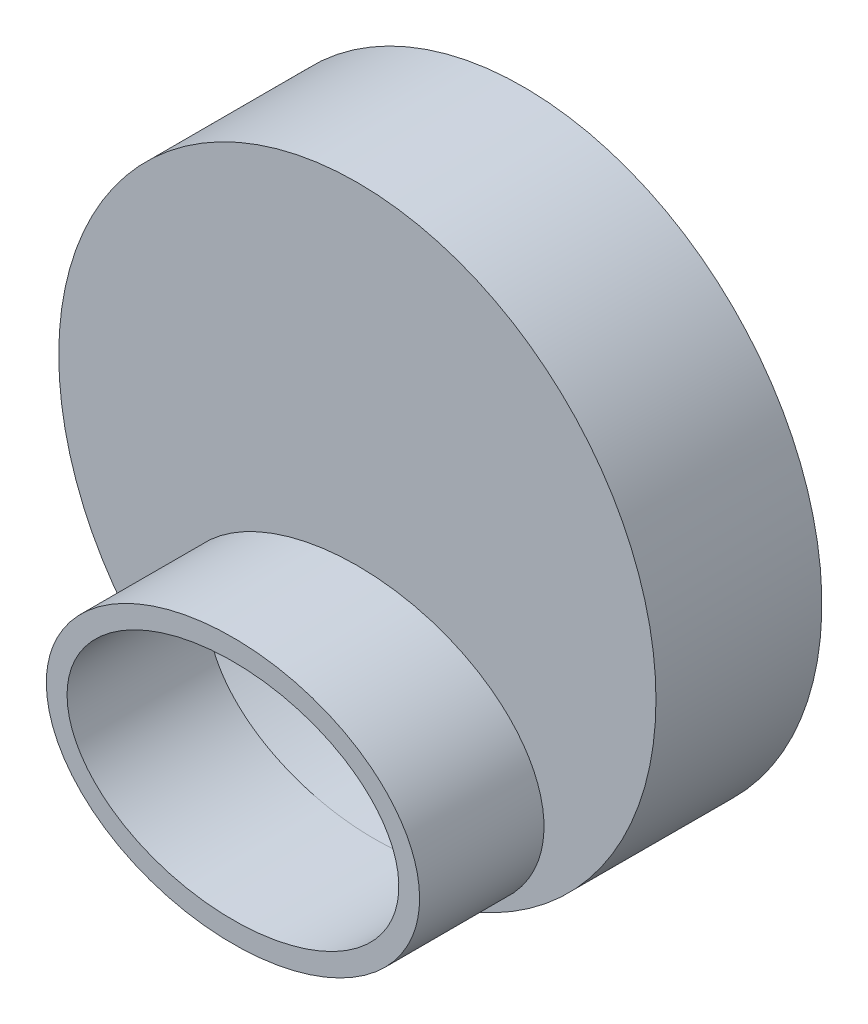
ISO-10303-21;
HEADER;
FILE_DESCRIPTION(('STEP AP214'),'2;1');
FILE_NAME('part.step','',(''),(''),'','','');
FILE_SCHEMA(('AUTOMOTIVE_DESIGN { 1 0 10303 214 1 1 1 1 }'));
ENDSEC;
DATA;
#1=APPLICATION_CONTEXT('core data for automotive mechanical design processes');
#2=APPLICATION_PROTOCOL_DEFINITION('international standard','automotive_design',2000,#1);
#3=PRODUCT_CONTEXT('',#1,'mechanical');
#4=PRODUCT('Part','Part','',(#3));
#5=PRODUCT_RELATED_PRODUCT_CATEGORY('part','',(#4));
#6=PRODUCT_DEFINITION_FORMATION('','',#4);
#7=PRODUCT_DEFINITION_CONTEXT('part definition',#1,'design');
#8=PRODUCT_DEFINITION('design','',#6,#7);
#9=PRODUCT_DEFINITION_SHAPE('','',#8);
#10=(LENGTH_UNIT() NAMED_UNIT(*) SI_UNIT(.MILLI.,.METRE.));
#11=(NAMED_UNIT(*) PLANE_ANGLE_UNIT() SI_UNIT($,.RADIAN.));
#12=(NAMED_UNIT(*) SI_UNIT($,.STERADIAN.) SOLID_ANGLE_UNIT());
#13=UNCERTAINTY_MEASURE_WITH_UNIT(LENGTH_MEASURE(1.E-05),#10,'distance_accuracy_value','');
#14=(GEOMETRIC_REPRESENTATION_CONTEXT(3) GLOBAL_UNCERTAINTY_ASSIGNED_CONTEXT((#13)) GLOBAL_UNIT_ASSIGNED_CONTEXT((#10,
#11,#12)) REPRESENTATION_CONTEXT('',''));
#15=CARTESIAN_POINT('',(0.,0.,0.));
#16=DIRECTION('',(0.,0.,1.));
#17=DIRECTION('',(1.,0.,0.));
#18=AXIS2_PLACEMENT_3D('',#15,#16,#17);
#19=CARTESIAN_POINT('',(0.,20.,0.));
#20=DIRECTION('',(0.,0.,1.));
#21=DIRECTION('',(1.,0.,0.));
#22=AXIS2_PLACEMENT_3D('',#19,#20,#21);
#23=PLANE('',#22);
#24=CARTESIAN_POINT('',(0.,0.,0.));
#25=DIRECTION('',(0.,0.,1.));
#26=DIRECTION('',(-1.,0.,0.));
#27=AXIS2_PLACEMENT_3D('',#24,#25,#26);
#28=ELLIPSE('',#27,20.,13.5);
#29=CARTESIAN_POINT('',(0.,-13.5,0.));
#30=VERTEX_POINT('',#29);
#31=EDGE_CURVE('E52',#30,#30,#28,.T.);
#32=ORIENTED_EDGE('',*,*,#31,.T.);
#33=CARTESIAN_POINT('',(0.,20.,0.));
#34=DIRECTION('',(0.,0.,-1.));
#35=DIRECTION('',(-1.,0.,0.));
#36=AXIS2_PLACEMENT_3D('',#33,#34,#35);
#37=CIRCLE('',#36,33.5);
#38=EDGE_CURVE('E57',#30,#30,#37,.T.);
#39=ORIENTED_EDGE('',*,*,#38,.T.);
#40=EDGE_LOOP('',(#32,#39));
#41=FACE_BOUND('',#40,.T.);
#42=ADVANCED_FACE('F43',(#41),#23,.F.);
#43=CARTESIAN_POINT('',(0.,20.,2.));
#44=DIRECTION('',(0.,0.,1.));
#45=DIRECTION('',(1.,0.,0.));
#46=AXIS2_PLACEMENT_3D('',#43,#44,#45);
#47=PLANE('',#46);
#48=CARTESIAN_POINT('',(0.,20.,2.));
#49=DIRECTION('',(0.,0.,1.));
#50=DIRECTION('',(1.,0.,0.));
#51=AXIS2_PLACEMENT_3D('',#48,#49,#50);
#52=CIRCLE('',#51,36.);
#53=CARTESIAN_POINT('',(0.,-16.,2.));
#54=VERTEX_POINT('',#53);
#55=EDGE_CURVE('E11',#54,#54,#52,.T.);
#56=ORIENTED_EDGE('',*,*,#55,.T.);
#57=CARTESIAN_POINT('',(0.,0.,2.));
#58=DIRECTION('',(0.,0.,1.));
#59=DIRECTION('',(-1.,0.,0.));
#60=AXIS2_PLACEMENT_3D('',#57,#58,#59);
#61=ELLIPSE('',#60,22.5,16.);
#62=EDGE_CURVE('E65',#54,#54,#61,.T.);
#63=ORIENTED_EDGE('',*,*,#62,.F.);
#64=EDGE_LOOP('',(#56,#63));
#65=FACE_BOUND('',#64,.T.);
#66=ADVANCED_FACE('F63',(#65),#47,.T.);
#67=CARTESIAN_POINT('',(0.,20.,2.));
#68=DIRECTION('',(0.,0.,-1.));
#69=DIRECTION('',(-1.,0.,0.));
#70=AXIS2_PLACEMENT_3D('',#67,#68,#69);
#71=CYLINDRICAL_SURFACE('',#70,36.);
#72=ORIENTED_EDGE('',*,*,#55,.F.);
#73=EDGE_LOOP('',(#72));
#74=FACE_BOUND('',#73,.T.);
#75=CARTESIAN_POINT('',(0.,20.,-18.));
#76=DIRECTION('',(0.,0.,-1.));
#77=DIRECTION('',(-1.,0.,0.));
#78=AXIS2_PLACEMENT_3D('',#75,#76,#77);
#79=CIRCLE('',#78,36.);
#80=CARTESIAN_POINT('',(-36.,20.,-18.));
#81=VERTEX_POINT('',#80);
#82=EDGE_CURVE('E76',#81,#81,#79,.T.);
#83=ORIENTED_EDGE('',*,*,#82,.F.);
#84=EDGE_LOOP('',(#83));
#85=FACE_BOUND('',#84,.T.);
#86=ADVANCED_FACE('F45',(#74,#85),#71,.T.);
#87=CARTESIAN_POINT('',(0.,0.,2.));
#88=DIRECTION('',(0.,0.,1.));
#89=DIRECTION('',(-1.,0.,0.));
#90=AXIS2_PLACEMENT_3D('',#87,#88,#89);
#91=ELLIPSE('',#90,20.,13.5);
#92=DIRECTION('',(0.,0.,-1.));
#93=VECTOR('',#92,1.);
#94=SURFACE_OF_LINEAR_EXTRUSION('',#91,#93);
#95=ORIENTED_EDGE('',*,*,#31,.F.);
#96=EDGE_LOOP('',(#95));
#97=FACE_BOUND('',#96,.T.);
#98=CARTESIAN_POINT('',(0.,0.,17.));
#99=DIRECTION('',(0.,0.,1.));
#100=DIRECTION('',(-1.,0.,0.));
#101=AXIS2_PLACEMENT_3D('',#98,#99,#100);
#102=ELLIPSE('',#101,20.,13.5);
#103=CARTESIAN_POINT('',(-20.,0.,17.));
#104=VERTEX_POINT('',#103);
#105=EDGE_CURVE('E69',#104,#104,#102,.T.);
#106=ORIENTED_EDGE('',*,*,#105,.T.);
#107=EDGE_LOOP('',(#106));
#108=FACE_BOUND('',#107,.T.);
#109=ADVANCED_FACE('F82',(#97,#108),#94,.T.);
#110=CARTESIAN_POINT('',(0.,0.,17.));
#111=DIRECTION('',(0.,0.,1.));
#112=DIRECTION('',(1.,0.,0.));
#113=AXIS2_PLACEMENT_3D('',#110,#111,#112);
#114=PLANE('',#113);
#115=CARTESIAN_POINT('',(0.,0.,17.));
#116=DIRECTION('',(0.,0.,1.));
#117=DIRECTION('',(-1.,0.,0.));
#118=AXIS2_PLACEMENT_3D('',#115,#116,#117);
#119=ELLIPSE('',#118,22.5,16.);
#120=CARTESIAN_POINT('',(-22.5,0.,17.));
#121=VERTEX_POINT('',#120);
#122=EDGE_CURVE('E68',#121,#121,#119,.T.);
#123=ORIENTED_EDGE('',*,*,#122,.T.);
#124=EDGE_LOOP('',(#123));
#125=FACE_BOUND('',#124,.T.);
#126=ORIENTED_EDGE('',*,*,#105,.F.);
#127=EDGE_LOOP('',(#126));
#128=FACE_BOUND('',#127,.T.);
#129=ADVANCED_FACE('F86',(#125,#128),#114,.T.);
#130=DIRECTION('',(0.,0.,-1.));
#131=VECTOR('',#130,1.);
#132=SURFACE_OF_LINEAR_EXTRUSION('',#119,#131);
#133=ORIENTED_EDGE('',*,*,#122,.F.);
#134=EDGE_LOOP('',(#133));
#135=FACE_BOUND('',#134,.T.);
#136=ORIENTED_EDGE('',*,*,#62,.T.);
#137=EDGE_LOOP('',(#136));
#138=FACE_BOUND('',#137,.T.);
#139=ADVANCED_FACE('F88',(#135,#138),#132,.F.);
#140=CARTESIAN_POINT('',(0.,20.,-18.));
#141=DIRECTION('',(0.,0.,-1.));
#142=DIRECTION('',(-1.,0.,0.));
#143=AXIS2_PLACEMENT_3D('',#140,#141,#142);
#144=PLANE('',#143);
#145=ORIENTED_EDGE('',*,*,#82,.T.);
#146=EDGE_LOOP('',(#145));
#147=FACE_BOUND('',#146,.T.);
#148=CARTESIAN_POINT('',(0.,20.,-18.));
#149=DIRECTION('',(0.,0.,-1.));
#150=DIRECTION('',(-1.,0.,0.));
#151=AXIS2_PLACEMENT_3D('',#148,#149,#150);
#152=CIRCLE('',#151,33.5);
#153=CARTESIAN_POINT('',(-33.5,20.,-18.));
#154=VERTEX_POINT('',#153);
#155=EDGE_CURVE('E119',#154,#154,#152,.T.);
#156=ORIENTED_EDGE('',*,*,#155,.F.);
#157=EDGE_LOOP('',(#156));
#158=FACE_BOUND('',#157,.T.);
#159=ADVANCED_FACE('F106',(#147,#158),#144,.T.);
#160=CARTESIAN_POINT('',(0.,20.,-18.));
#161=DIRECTION('',(0.,0.,1.));
#162=DIRECTION('',(1.,0.,0.));
#163=AXIS2_PLACEMENT_3D('',#160,#161,#162);
#164=CYLINDRICAL_SURFACE('',#163,33.5);
#165=ORIENTED_EDGE('',*,*,#155,.T.);
#166=EDGE_LOOP('',(#165));
#167=FACE_BOUND('',#166,.T.);
#168=ORIENTED_EDGE('',*,*,#38,.F.);
#169=EDGE_LOOP('',(#168));
#170=FACE_BOUND('',#169,.T.);
#171=ADVANCED_FACE('F111',(#167,#170),#164,.F.);
#172=CLOSED_SHELL('',(#42,#66,#86,#109,#129,#139,#159,#171));
#173=MANIFOLD_SOLID_BREP('B2',#172);
#174=ADVANCED_BREP_SHAPE_REPRESENTATION('',(#18,#173),#14);
#175=SHAPE_DEFINITION_REPRESENTATION(#9,#174);
ENDSEC;
END-ISO-10303-21;
